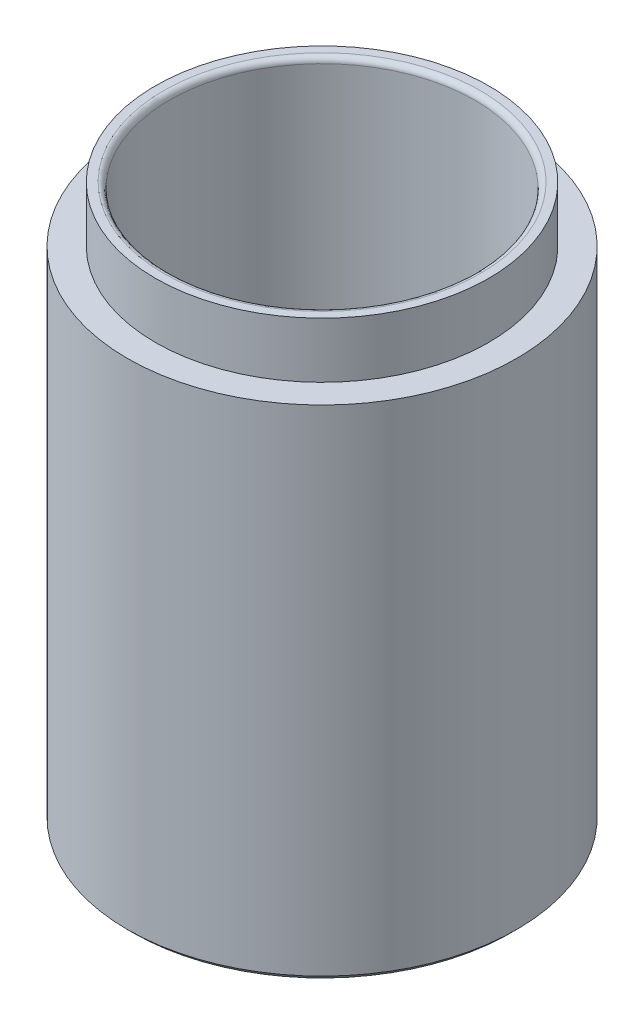
ISO-10303-21;
HEADER;
FILE_DESCRIPTION(('STEP AP214'),'2;1');
FILE_NAME('part.step','',(''),(''),'','','');
FILE_SCHEMA(('AUTOMOTIVE_DESIGN { 1 0 10303 214 1 1 1 1 }'));
ENDSEC;
DATA;
#1=APPLICATION_CONTEXT('core data for automotive mechanical design processes');
#2=APPLICATION_PROTOCOL_DEFINITION('international standard','automotive_design',2000,#1);
#3=PRODUCT_CONTEXT('',#1,'mechanical');
#4=PRODUCT('Part','Part','',(#3));
#5=PRODUCT_RELATED_PRODUCT_CATEGORY('part','',(#4));
#6=PRODUCT_DEFINITION_FORMATION('','',#4);
#7=PRODUCT_DEFINITION_CONTEXT('part definition',#1,'design');
#8=PRODUCT_DEFINITION('design','',#6,#7);
#9=PRODUCT_DEFINITION_SHAPE('','',#8);
#10=(LENGTH_UNIT() NAMED_UNIT(*) SI_UNIT(.MILLI.,.METRE.));
#11=(NAMED_UNIT(*) PLANE_ANGLE_UNIT() SI_UNIT($,.RADIAN.));
#12=(NAMED_UNIT(*) SI_UNIT($,.STERADIAN.) SOLID_ANGLE_UNIT());
#13=UNCERTAINTY_MEASURE_WITH_UNIT(LENGTH_MEASURE(1.E-05),#10,'distance_accuracy_value','');
#14=(GEOMETRIC_REPRESENTATION_CONTEXT(3) GLOBAL_UNCERTAINTY_ASSIGNED_CONTEXT((#13)) GLOBAL_UNIT_ASSIGNED_CONTEXT((#10,
#11,#12)) REPRESENTATION_CONTEXT('',''));
#15=CARTESIAN_POINT('',(0.,0.,0.));
#16=DIRECTION('',(0.,0.,1.));
#17=DIRECTION('',(1.,0.,0.));
#18=AXIS2_PLACEMENT_3D('',#15,#16,#17);
#19=CARTESIAN_POINT('',(0.,-100.,0.));
#20=DIRECTION('',(0.,1.,0.));
#21=DIRECTION('',(0.,0.,1.));
#22=AXIS2_PLACEMENT_3D('',#19,#20,#21);
#23=CYLINDRICAL_SURFACE('',#22,35.);
#24=CARTESIAN_POINT('',(0.,-99.,0.));
#25=DIRECTION('',(0.,1.,0.));
#26=DIRECTION('',(0.,0.,1.));
#27=AXIS2_PLACEMENT_3D('',#24,#25,#26);
#28=CIRCLE('',#27,35.);
#29=CARTESIAN_POINT('',(0.,-99.,35.));
#30=VERTEX_POINT('',#29);
#31=EDGE_CURVE('E54',#30,#30,#28,.T.);
#32=ORIENTED_EDGE('',*,*,#31,.T.);
#33=EDGE_LOOP('',(#32));
#34=FACE_BOUND('',#33,.T.);
#35=CARTESIAN_POINT('',(0.,-10.,0.));
#36=DIRECTION('',(0.,1.,0.));
#37=DIRECTION('',(0.,0.,1.));
#38=AXIS2_PLACEMENT_3D('',#35,#36,#37);
#39=CIRCLE('',#38,35.);
#40=CARTESIAN_POINT('',(0.,-10.,35.));
#41=VERTEX_POINT('',#40);
#42=EDGE_CURVE('E59',#41,#41,#39,.T.);
#43=ORIENTED_EDGE('',*,*,#42,.F.);
#44=EDGE_LOOP('',(#43));
#45=FACE_BOUND('',#44,.T.);
#46=ADVANCED_FACE('F39',(#34,#45),#23,.T.);
#47=CARTESIAN_POINT('',(0.,-100.,0.));
#48=DIRECTION('',(0.,1.,0.));
#49=DIRECTION('',(0.,0.,1.));
#50=AXIS2_PLACEMENT_3D('',#47,#48,#49);
#51=PLANE('',#50);
#52=CARTESIAN_POINT('',(0.,-100.,0.));
#53=DIRECTION('',(0.,1.,0.));
#54=DIRECTION('',(0.,0.,1.));
#55=AXIS2_PLACEMENT_3D('',#52,#53,#54);
#56=CIRCLE('',#55,34.);
#57=CARTESIAN_POINT('',(0.,-100.,34.));
#58=VERTEX_POINT('',#57);
#59=EDGE_CURVE('E50',#58,#58,#56,.F.);
#60=ORIENTED_EDGE('',*,*,#59,.T.);
#61=EDGE_LOOP('',(#60));
#62=FACE_BOUND('',#61,.T.);
#63=ADVANCED_FACE('F89',(#62),#51,.F.);
#64=CARTESIAN_POINT('',(0.,-10.,0.));
#65=DIRECTION('',(0.,1.,0.));
#66=DIRECTION('',(0.,0.,1.));
#67=AXIS2_PLACEMENT_3D('',#64,#65,#66);
#68=CYLINDRICAL_SURFACE('',#67,30.);
#69=CARTESIAN_POINT('',(0.,-10.,0.));
#70=DIRECTION('',(0.,1.,0.));
#71=DIRECTION('',(0.,0.,1.));
#72=AXIS2_PLACEMENT_3D('',#69,#70,#71);
#73=CIRCLE('',#72,30.);
#74=CARTESIAN_POINT('',(0.,-10.,30.));
#75=VERTEX_POINT('',#74);
#76=EDGE_CURVE('E63',#75,#75,#73,.T.);
#77=ORIENTED_EDGE('',*,*,#76,.T.);
#78=EDGE_LOOP('',(#77));
#79=FACE_BOUND('',#78,.T.);
#80=CARTESIAN_POINT('',(0.,0.,0.));
#81=DIRECTION('',(0.,1.,0.));
#82=DIRECTION('',(0.,0.,1.));
#83=AXIS2_PLACEMENT_3D('',#80,#81,#82);
#84=CIRCLE('',#83,30.);
#85=CARTESIAN_POINT('',(0.,0.,30.));
#86=VERTEX_POINT('',#85);
#87=EDGE_CURVE('E60',#86,#86,#84,.T.);
#88=ORIENTED_EDGE('',*,*,#87,.F.);
#89=EDGE_LOOP('',(#88));
#90=FACE_BOUND('',#89,.T.);
#91=ADVANCED_FACE('F96',(#79,#90),#68,.T.);
#92=CARTESIAN_POINT('',(0.,-10.,0.));
#93=DIRECTION('',(0.,1.,0.));
#94=DIRECTION('',(0.,0.,1.));
#95=AXIS2_PLACEMENT_3D('',#92,#93,#94);
#96=PLANE('',#95);
#97=ORIENTED_EDGE('',*,*,#76,.F.);
#98=EDGE_LOOP('',(#97));
#99=FACE_BOUND('',#98,.T.);
#100=ORIENTED_EDGE('',*,*,#42,.T.);
#101=EDGE_LOOP('',(#100));
#102=FACE_BOUND('',#101,.T.);
#103=ADVANCED_FACE('F85',(#99,#102),#96,.T.);
#104=CARTESIAN_POINT('',(0.,0.,0.));
#105=DIRECTION('',(0.,1.,0.));
#106=DIRECTION('',(0.,0.,1.));
#107=AXIS2_PLACEMENT_3D('',#104,#105,#106);
#108=PLANE('',#107);
#109=CARTESIAN_POINT('',(0.,0.,0.));
#110=DIRECTION('',(0.,1.,0.));
#111=DIRECTION('',(0.,0.,1.));
#112=AXIS2_PLACEMENT_3D('',#109,#110,#111);
#113=CIRCLE('',#112,28.5);
#114=CARTESIAN_POINT('',(0.,0.,28.5));
#115=VERTEX_POINT('',#114);
#116=EDGE_CURVE('E10',#115,#115,#113,.F.);
#117=ORIENTED_EDGE('',*,*,#116,.T.);
#118=EDGE_LOOP('',(#117));
#119=FACE_BOUND('',#118,.T.);
#120=ORIENTED_EDGE('',*,*,#87,.T.);
#121=EDGE_LOOP('',(#120));
#122=FACE_BOUND('',#121,.T.);
#123=ADVANCED_FACE('F76',(#119,#122),#108,.T.);
#124=CARTESIAN_POINT('',(0.,-95.,0.));
#125=DIRECTION('',(0.,1.,0.));
#126=DIRECTION('',(0.,0.,1.));
#127=AXIS2_PLACEMENT_3D('',#124,#125,#126);
#128=CYLINDRICAL_SURFACE('',#127,27.5);
#129=CARTESIAN_POINT('',(0.,-1.,0.));
#130=DIRECTION('',(0.,1.,0.));
#131=DIRECTION('',(0.,0.,1.));
#132=AXIS2_PLACEMENT_3D('',#129,#130,#131);
#133=CIRCLE('',#132,27.5);
#134=CARTESIAN_POINT('',(0.,-1.,27.5));
#135=VERTEX_POINT('',#134);
#136=EDGE_CURVE('E46',#135,#135,#133,.T.);
#137=ORIENTED_EDGE('',*,*,#136,.T.);
#138=EDGE_LOOP('',(#137));
#139=FACE_BOUND('',#138,.T.);
#140=CARTESIAN_POINT('',(0.,-95.,0.));
#141=DIRECTION('',(0.,1.,0.));
#142=DIRECTION('',(0.,0.,1.));
#143=AXIS2_PLACEMENT_3D('',#140,#141,#142);
#144=CIRCLE('',#143,27.5);
#145=CARTESIAN_POINT('',(0.,-95.,27.5));
#146=VERTEX_POINT('',#145);
#147=EDGE_CURVE('E64',#146,#146,#144,.T.);
#148=ORIENTED_EDGE('',*,*,#147,.F.);
#149=EDGE_LOOP('',(#148));
#150=FACE_BOUND('',#149,.T.);
#151=ADVANCED_FACE('F74',(#139,#150),#128,.F.);
#152=CARTESIAN_POINT('',(0.,-95.,0.));
#153=DIRECTION('',(0.,1.,0.));
#154=DIRECTION('',(0.,0.,1.));
#155=AXIS2_PLACEMENT_3D('',#152,#153,#154);
#156=PLANE('',#155);
#157=ORIENTED_EDGE('',*,*,#147,.T.);
#158=EDGE_LOOP('',(#157));
#159=FACE_BOUND('',#158,.T.);
#160=ADVANCED_FACE('F72',(#159),#156,.T.);
#161=CARTESIAN_POINT('',(0.,-99.,0.));
#162=DIRECTION('',(0.,1.,0.));
#163=DIRECTION('',(0.,0.,1.));
#164=AXIS2_PLACEMENT_3D('',#161,#162,#163);
#165=CONICAL_SURFACE('',#164,35.,0.785398163397452);
#166=ORIENTED_EDGE('',*,*,#59,.F.);
#167=EDGE_LOOP('',(#166));
#168=FACE_BOUND('',#167,.T.);
#169=ORIENTED_EDGE('',*,*,#31,.F.);
#170=EDGE_LOOP('',(#169));
#171=FACE_BOUND('',#170,.T.);
#172=ADVANCED_FACE('F83',(#168,#171),#165,.T.);
#173=CARTESIAN_POINT('',(0.,-1.,0.));
#174=DIRECTION('',(0.,1.,0.));
#175=DIRECTION('',(0.,0.,1.));
#176=AXIS2_PLACEMENT_3D('',#173,#174,#175);
#177=TOROIDAL_SURFACE('',#176,28.5,1.);
#178=ORIENTED_EDGE('',*,*,#116,.F.);
#179=EDGE_LOOP('',(#178));
#180=FACE_BOUND('',#179,.T.);
#181=ORIENTED_EDGE('',*,*,#136,.F.);
#182=EDGE_LOOP('',(#181));
#183=FACE_BOUND('',#182,.T.);
#184=ADVANCED_FACE('F41',(#180,#183),#177,.T.);
#185=CLOSED_SHELL('',(#46,#63,#91,#103,#123,#151,#160,#172,#184));
#186=MANIFOLD_SOLID_BREP('B2',#185);
#187=ADVANCED_BREP_SHAPE_REPRESENTATION('',(#18,#186),#14);
#188=SHAPE_DEFINITION_REPRESENTATION(#9,#187);
ENDSEC;
END-ISO-10303-21;
